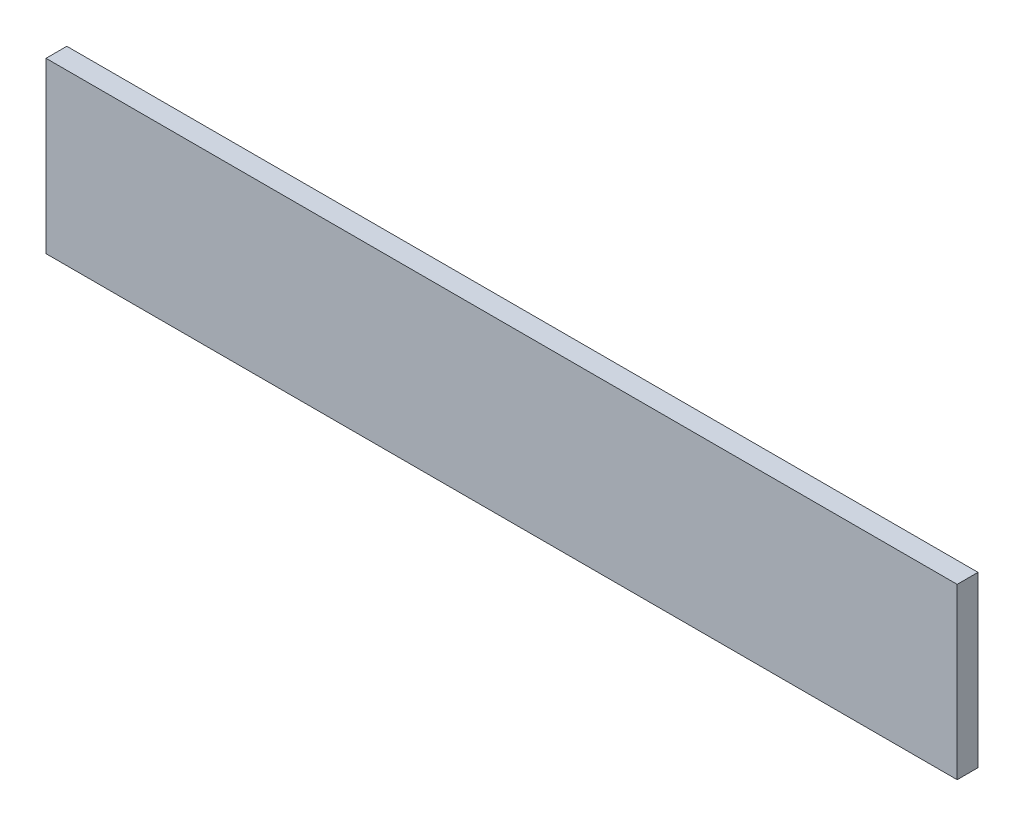
ISO-10303-21;
HEADER;
FILE_DESCRIPTION(('STEP AP214'),'2;1');
FILE_NAME('part.step','',(''),(''),'','','');
FILE_SCHEMA(('AUTOMOTIVE_DESIGN { 1 0 10303 214 1 1 1 1 }'));
ENDSEC;
DATA;
#1=APPLICATION_CONTEXT('core data for automotive mechanical design processes');
#2=APPLICATION_PROTOCOL_DEFINITION('international standard','automotive_design',2000,#1);
#3=PRODUCT_CONTEXT('',#1,'mechanical');
#4=PRODUCT('Part','Part','',(#3));
#5=PRODUCT_RELATED_PRODUCT_CATEGORY('part','',(#4));
#6=PRODUCT_DEFINITION_FORMATION('','',#4);
#7=PRODUCT_DEFINITION_CONTEXT('part definition',#1,'design');
#8=PRODUCT_DEFINITION('design','',#6,#7);
#9=PRODUCT_DEFINITION_SHAPE('','',#8);
#10=(LENGTH_UNIT() NAMED_UNIT(*) SI_UNIT(.MILLI.,.METRE.));
#11=(NAMED_UNIT(*) PLANE_ANGLE_UNIT() SI_UNIT($,.RADIAN.));
#12=(NAMED_UNIT(*) SI_UNIT($,.STERADIAN.) SOLID_ANGLE_UNIT());
#13=UNCERTAINTY_MEASURE_WITH_UNIT(LENGTH_MEASURE(1.E-05),#10,'distance_accuracy_value','');
#14=(GEOMETRIC_REPRESENTATION_CONTEXT(3) GLOBAL_UNCERTAINTY_ASSIGNED_CONTEXT((#13)) GLOBAL_UNIT_ASSIGNED_CONTEXT((#10,
#11,#12)) REPRESENTATION_CONTEXT('',''));
#15=CARTESIAN_POINT('',(0.,0.,0.));
#16=DIRECTION('',(0.,0.,1.));
#17=DIRECTION('',(1.,0.,0.));
#18=AXIS2_PLACEMENT_3D('',#15,#16,#17);
#19=CARTESIAN_POINT('',(35.,-6.5,1.6));
#20=DIRECTION('',(-1.,0.,0.));
#21=DIRECTION('',(0.,0.,1.));
#22=AXIS2_PLACEMENT_3D('',#19,#20,#21);
#23=PLANE('',#22);
#24=DIRECTION('',(0.,1.,0.));
#25=VECTOR('',#24,1.);
#26=CARTESIAN_POINT('',(35.,-6.5,0.));
#27=LINE('',#26,#25);
#28=CARTESIAN_POINT('',(35.,-6.5,0.));
#29=VERTEX_POINT('',#28);
#30=CARTESIAN_POINT('',(35.,6.5,0.));
#31=VERTEX_POINT('',#30);
#32=EDGE_CURVE('E111',#29,#31,#27,.T.);
#33=ORIENTED_EDGE('',*,*,#32,.T.);
#34=DIRECTION('',(0.,0.,-1.));
#35=VECTOR('',#34,1.);
#36=CARTESIAN_POINT('',(35.,6.5,1.6));
#37=LINE('',#36,#35);
#38=CARTESIAN_POINT('',(35.,6.5,1.6));
#39=VERTEX_POINT('',#38);
#40=EDGE_CURVE('E11',#39,#31,#37,.T.);
#41=ORIENTED_EDGE('',*,*,#40,.F.);
#42=DIRECTION('',(0.,1.,0.));
#43=VECTOR('',#42,1.);
#44=CARTESIAN_POINT('',(35.,-6.5,1.6));
#45=LINE('',#44,#43);
#46=CARTESIAN_POINT('',(35.,-6.5,1.6));
#47=VERTEX_POINT('',#46);
#48=EDGE_CURVE('E95',#47,#39,#45,.T.);
#49=ORIENTED_EDGE('',*,*,#48,.F.);
#50=DIRECTION('',(0.,0.,-1.));
#51=VECTOR('',#50,1.);
#52=CARTESIAN_POINT('',(35.,-6.5,1.6));
#53=LINE('',#52,#51);
#54=EDGE_CURVE('E107',#47,#29,#53,.T.);
#55=ORIENTED_EDGE('',*,*,#54,.T.);
#56=EDGE_LOOP('',(#33,#41,#49,#55));
#57=FACE_BOUND('',#56,.T.);
#58=ADVANCED_FACE('F43',(#57),#23,.F.);
#59=CARTESIAN_POINT('',(-35.,6.5,1.6));
#60=DIRECTION('',(0.,-1.,0.));
#61=DIRECTION('',(0.,0.,-1.));
#62=AXIS2_PLACEMENT_3D('',#59,#60,#61);
#63=PLANE('',#62);
#64=DIRECTION('',(-1.,0.,0.));
#65=VECTOR('',#64,1.);
#66=CARTESIAN_POINT('',(-35.,6.5,0.));
#67=LINE('',#66,#65);
#68=CARTESIAN_POINT('',(-35.,6.5,0.));
#69=VERTEX_POINT('',#68);
#70=EDGE_CURVE('E100',#31,#69,#67,.T.);
#71=ORIENTED_EDGE('',*,*,#70,.T.);
#72=DIRECTION('',(0.,0.,-1.));
#73=VECTOR('',#72,1.);
#74=CARTESIAN_POINT('',(-35.,6.5,1.6));
#75=LINE('',#74,#73);
#76=CARTESIAN_POINT('',(-35.,6.5,1.6));
#77=VERTEX_POINT('',#76);
#78=EDGE_CURVE('E52',#77,#69,#75,.T.);
#79=ORIENTED_EDGE('',*,*,#78,.F.);
#80=DIRECTION('',(-1.,0.,0.));
#81=VECTOR('',#80,1.);
#82=CARTESIAN_POINT('',(-35.,6.5,1.6));
#83=LINE('',#82,#81);
#84=EDGE_CURVE('E90',#39,#77,#83,.T.);
#85=ORIENTED_EDGE('',*,*,#84,.F.);
#86=ORIENTED_EDGE('',*,*,#40,.T.);
#87=EDGE_LOOP('',(#71,#79,#85,#86));
#88=FACE_BOUND('',#87,.T.);
#89=ADVANCED_FACE('F99',(#88),#63,.F.);
#90=CARTESIAN_POINT('',(-35.,-6.5,1.6));
#91=DIRECTION('',(1.,0.,0.));
#92=DIRECTION('',(0.,0.,-1.));
#93=AXIS2_PLACEMENT_3D('',#90,#91,#92);
#94=PLANE('',#93);
#95=DIRECTION('',(0.,-1.,0.));
#96=VECTOR('',#95,1.);
#97=CARTESIAN_POINT('',(-35.,-6.5,0.));
#98=LINE('',#97,#96);
#99=CARTESIAN_POINT('',(-35.,-6.5,0.));
#100=VERTEX_POINT('',#99);
#101=EDGE_CURVE('E77',#69,#100,#98,.T.);
#102=ORIENTED_EDGE('',*,*,#101,.T.);
#103=DIRECTION('',(0.,0.,-1.));
#104=VECTOR('',#103,1.);
#105=CARTESIAN_POINT('',(-35.,-6.5,1.6));
#106=LINE('',#105,#104);
#107=CARTESIAN_POINT('',(-35.,-6.5,1.6));
#108=VERTEX_POINT('',#107);
#109=EDGE_CURVE('E102',#108,#100,#106,.T.);
#110=ORIENTED_EDGE('',*,*,#109,.F.);
#111=DIRECTION('',(0.,-1.,0.));
#112=VECTOR('',#111,1.);
#113=CARTESIAN_POINT('',(-35.,-6.5,1.6));
#114=LINE('',#113,#112);
#115=EDGE_CURVE('E93',#77,#108,#114,.T.);
#116=ORIENTED_EDGE('',*,*,#115,.F.);
#117=ORIENTED_EDGE('',*,*,#78,.T.);
#118=EDGE_LOOP('',(#102,#110,#116,#117));
#119=FACE_BOUND('',#118,.T.);
#120=ADVANCED_FACE('F103',(#119),#94,.F.);
#121=CARTESIAN_POINT('',(-35.,-6.5,1.6));
#122=DIRECTION('',(0.,1.,0.));
#123=DIRECTION('',(0.,0.,1.));
#124=AXIS2_PLACEMENT_3D('',#121,#122,#123);
#125=PLANE('',#124);
#126=DIRECTION('',(1.,0.,0.));
#127=VECTOR('',#126,1.);
#128=CARTESIAN_POINT('',(-35.,-6.5,0.));
#129=LINE('',#128,#127);
#130=EDGE_CURVE('E83',#100,#29,#129,.T.);
#131=ORIENTED_EDGE('',*,*,#130,.T.);
#132=ORIENTED_EDGE('',*,*,#54,.F.);
#133=DIRECTION('',(1.,0.,0.));
#134=VECTOR('',#133,1.);
#135=CARTESIAN_POINT('',(-35.,-6.5,1.6));
#136=LINE('',#135,#134);
#137=EDGE_CURVE('E60',#108,#47,#136,.T.);
#138=ORIENTED_EDGE('',*,*,#137,.F.);
#139=ORIENTED_EDGE('',*,*,#109,.T.);
#140=EDGE_LOOP('',(#131,#132,#138,#139));
#141=FACE_BOUND('',#140,.T.);
#142=ADVANCED_FACE('F124',(#141),#125,.F.);
#143=CARTESIAN_POINT('',(0.,0.,1.6));
#144=DIRECTION('',(0.,0.,-1.));
#145=DIRECTION('',(-1.,0.,0.));
#146=AXIS2_PLACEMENT_3D('',#143,#144,#145);
#147=PLANE('',#146);
#148=ORIENTED_EDGE('',*,*,#48,.T.);
#149=ORIENTED_EDGE('',*,*,#84,.T.);
#150=ORIENTED_EDGE('',*,*,#115,.T.);
#151=ORIENTED_EDGE('',*,*,#137,.T.);
#152=EDGE_LOOP('',(#148,#149,#150,#151));
#153=FACE_BOUND('',#152,.T.);
#154=ADVANCED_FACE('F91',(#153),#147,.F.);
#155=CARTESIAN_POINT('',(0.,0.,0.));
#156=DIRECTION('',(0.,0.,-1.));
#157=DIRECTION('',(-1.,0.,0.));
#158=AXIS2_PLACEMENT_3D('',#155,#156,#157);
#159=PLANE('',#158);
#160=ORIENTED_EDGE('',*,*,#32,.F.);
#161=ORIENTED_EDGE('',*,*,#130,.F.);
#162=ORIENTED_EDGE('',*,*,#101,.F.);
#163=ORIENTED_EDGE('',*,*,#70,.F.);
#164=EDGE_LOOP('',(#160,#161,#162,#163));
#165=FACE_BOUND('',#164,.T.);
#166=ADVANCED_FACE('F127',(#165),#159,.T.);
#167=CLOSED_SHELL('',(#58,#89,#120,#142,#154,#166));
#168=MANIFOLD_SOLID_BREP('B2',#167);
#169=ADVANCED_BREP_SHAPE_REPRESENTATION('',(#18,#168),#14);
#170=SHAPE_DEFINITION_REPRESENTATION(#9,#169);
ENDSEC;
END-ISO-10303-21;
